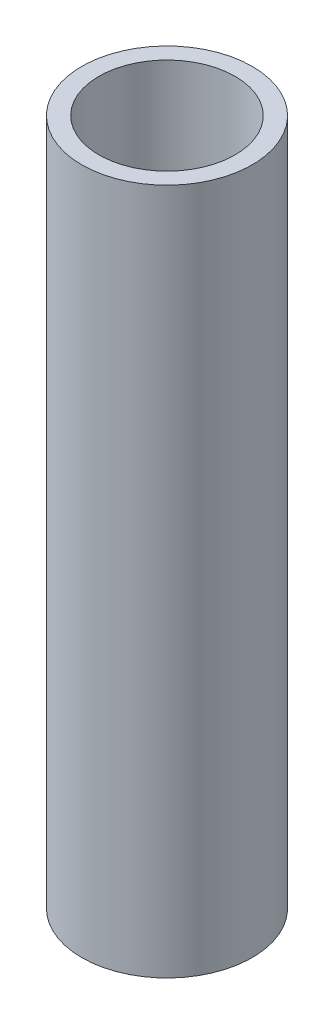
ISO-10303-21;
HEADER;
FILE_DESCRIPTION(('STEP AP214'),'2;1');
FILE_NAME('part.step','',(''),(''),'','','');
FILE_SCHEMA(('AUTOMOTIVE_DESIGN { 1 0 10303 214 1 1 1 1 }'));
ENDSEC;
DATA;
#1=APPLICATION_CONTEXT('core data for automotive mechanical design processes');
#2=APPLICATION_PROTOCOL_DEFINITION('international standard','automotive_design',2000,#1);
#3=PRODUCT_CONTEXT('',#1,'mechanical');
#4=PRODUCT('Part','Part','',(#3));
#5=PRODUCT_RELATED_PRODUCT_CATEGORY('part','',(#4));
#6=PRODUCT_DEFINITION_FORMATION('','',#4);
#7=PRODUCT_DEFINITION_CONTEXT('part definition',#1,'design');
#8=PRODUCT_DEFINITION('design','',#6,#7);
#9=PRODUCT_DEFINITION_SHAPE('','',#8);
#10=(LENGTH_UNIT() NAMED_UNIT(*) SI_UNIT(.MILLI.,.METRE.));
#11=(NAMED_UNIT(*) PLANE_ANGLE_UNIT() SI_UNIT($,.RADIAN.));
#12=(NAMED_UNIT(*) SI_UNIT($,.STERADIAN.) SOLID_ANGLE_UNIT());
#13=UNCERTAINTY_MEASURE_WITH_UNIT(LENGTH_MEASURE(1.E-05),#10,'distance_accuracy_value','');
#14=(GEOMETRIC_REPRESENTATION_CONTEXT(3) GLOBAL_UNCERTAINTY_ASSIGNED_CONTEXT((#13)) GLOBAL_UNIT_ASSIGNED_CONTEXT((#10,
#11,#12)) REPRESENTATION_CONTEXT('',''));
#15=CARTESIAN_POINT('',(0.,0.,0.));
#16=DIRECTION('',(0.,0.,1.));
#17=DIRECTION('',(1.,0.,0.));
#18=AXIS2_PLACEMENT_3D('',#15,#16,#17);
#19=CARTESIAN_POINT('',(0.,-100.,0.));
#20=DIRECTION('',(0.,1.,0.));
#21=DIRECTION('',(0.,0.,-1.));
#22=AXIS2_PLACEMENT_3D('',#19,#20,#21);
#23=CYLINDRICAL_SURFACE('',#22,12.4187);
#24=CARTESIAN_POINT('',(0.,-100.,0.));
#25=DIRECTION('',(0.,-1.,0.));
#26=DIRECTION('',(0.,0.,-1.));
#27=AXIS2_PLACEMENT_3D('',#24,#25,#26);
#28=CIRCLE('',#27,12.4187);
#29=CARTESIAN_POINT('',(0.,-100.,-12.4187));
#30=VERTEX_POINT('',#29);
#31=EDGE_CURVE('E10',#30,#30,#28,.T.);
#32=ORIENTED_EDGE('',*,*,#31,.F.);
#33=EDGE_LOOP('',(#32));
#34=FACE_BOUND('',#33,.T.);
#35=CARTESIAN_POINT('',(0.,0.,0.));
#36=DIRECTION('',(0.,-1.,0.));
#37=DIRECTION('',(0.,0.,-1.));
#38=AXIS2_PLACEMENT_3D('',#35,#36,#37);
#39=CIRCLE('',#38,12.4187);
#40=CARTESIAN_POINT('',(0.,0.,-12.4187));
#41=VERTEX_POINT('',#40);
#42=EDGE_CURVE('E36',#41,#41,#39,.T.);
#43=ORIENTED_EDGE('',*,*,#42,.T.);
#44=EDGE_LOOP('',(#43));
#45=FACE_BOUND('',#44,.T.);
#46=ADVANCED_FACE('F33',(#34,#45),#23,.T.);
#47=CARTESIAN_POINT('',(0.,-100.,0.));
#48=DIRECTION('',(0.,1.,0.));
#49=DIRECTION('',(0.,0.,-1.));
#50=AXIS2_PLACEMENT_3D('',#47,#48,#49);
#51=PLANE('',#50);
#52=ORIENTED_EDGE('',*,*,#31,.T.);
#53=EDGE_LOOP('',(#52));
#54=FACE_BOUND('',#53,.T.);
#55=ADVANCED_FACE('F63',(#54),#51,.F.);
#56=CARTESIAN_POINT('',(0.,0.,0.));
#57=DIRECTION('',(0.,1.,0.));
#58=DIRECTION('',(0.,0.,-1.));
#59=AXIS2_PLACEMENT_3D('',#56,#57,#58);
#60=PLANE('',#59);
#61=CARTESIAN_POINT('',(0.,0.,0.));
#62=DIRECTION('',(0.,-1.,0.));
#63=DIRECTION('',(0.,0.,-1.));
#64=AXIS2_PLACEMENT_3D('',#61,#62,#63);
#65=CIRCLE('',#64,9.9187);
#66=CARTESIAN_POINT('',(0.,0.,-9.9187));
#67=VERTEX_POINT('',#66);
#68=EDGE_CURVE('E45',#67,#67,#65,.T.);
#69=ORIENTED_EDGE('',*,*,#68,.T.);
#70=EDGE_LOOP('',(#69));
#71=FACE_BOUND('',#70,.T.);
#72=ORIENTED_EDGE('',*,*,#42,.F.);
#73=EDGE_LOOP('',(#72));
#74=FACE_BOUND('',#73,.T.);
#75=ADVANCED_FACE('F60',(#71,#74),#60,.T.);
#76=CARTESIAN_POINT('',(0.,-30.,0.));
#77=DIRECTION('',(0.,1.,0.));
#78=DIRECTION('',(0.,0.,-1.));
#79=AXIS2_PLACEMENT_3D('',#76,#77,#78);
#80=CYLINDRICAL_SURFACE('',#79,9.9187);
#81=CARTESIAN_POINT('',(0.,-30.,0.));
#82=DIRECTION('',(0.,-1.,0.));
#83=DIRECTION('',(0.,0.,-1.));
#84=AXIS2_PLACEMENT_3D('',#81,#82,#83);
#85=CIRCLE('',#84,9.9187);
#86=CARTESIAN_POINT('',(0.,-30.,-9.9187));
#87=VERTEX_POINT('',#86);
#88=EDGE_CURVE('E43',#87,#87,#85,.T.);
#89=ORIENTED_EDGE('',*,*,#88,.T.);
#90=EDGE_LOOP('',(#89));
#91=FACE_BOUND('',#90,.T.);
#92=ORIENTED_EDGE('',*,*,#68,.F.);
#93=EDGE_LOOP('',(#92));
#94=FACE_BOUND('',#93,.T.);
#95=ADVANCED_FACE('F51',(#91,#94),#80,.F.);
#96=CARTESIAN_POINT('',(0.,-30.,0.));
#97=DIRECTION('',(0.,1.,0.));
#98=DIRECTION('',(0.,0.,-1.));
#99=AXIS2_PLACEMENT_3D('',#96,#97,#98);
#100=PLANE('',#99);
#101=ORIENTED_EDGE('',*,*,#88,.F.);
#102=EDGE_LOOP('',(#101));
#103=FACE_BOUND('',#102,.T.);
#104=ADVANCED_FACE('F54',(#103),#100,.T.);
#105=CLOSED_SHELL('',(#46,#55,#75,#95,#104));
#106=MANIFOLD_SOLID_BREP('B2',#105);
#107=ADVANCED_BREP_SHAPE_REPRESENTATION('',(#18,#106),#14);
#108=SHAPE_DEFINITION_REPRESENTATION(#9,#107);
ENDSEC;
END-ISO-10303-21;
